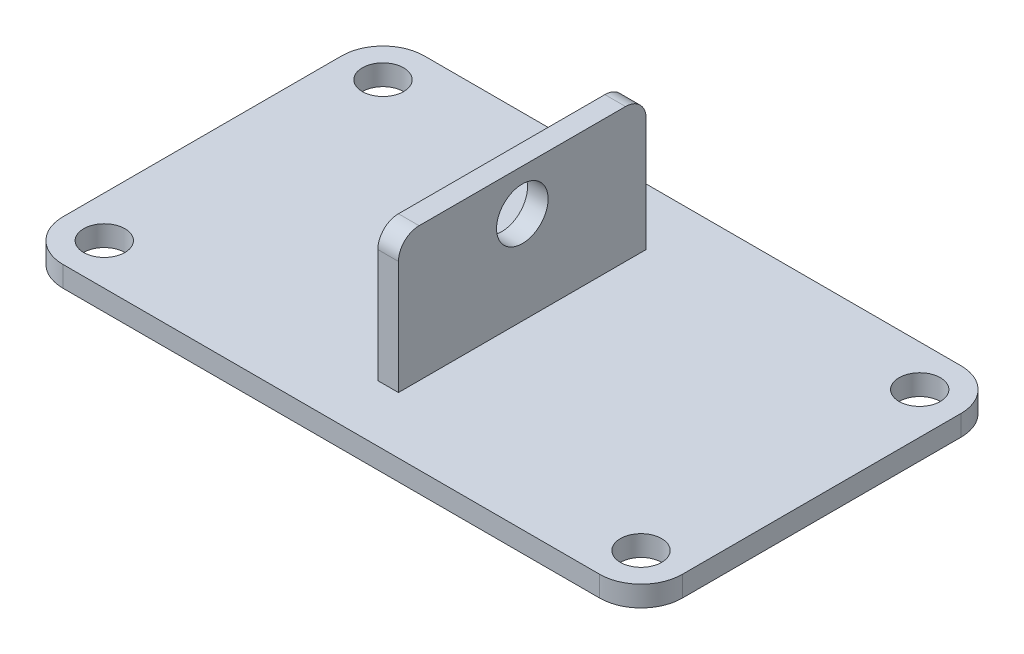
ISO-10303-21;
HEADER;
FILE_DESCRIPTION(('STEP AP214'),'2;1');
FILE_NAME('part.step','',(''),(''),'','','');
FILE_SCHEMA(('AUTOMOTIVE_DESIGN { 1 0 10303 214 1 1 1 1 }'));
ENDSEC;
DATA;
#1=APPLICATION_CONTEXT('core data for automotive mechanical design processes');
#2=APPLICATION_PROTOCOL_DEFINITION('international standard','automotive_design',2000,#1);
#3=PRODUCT_CONTEXT('',#1,'mechanical');
#4=PRODUCT('Part','Part','',(#3));
#5=PRODUCT_RELATED_PRODUCT_CATEGORY('part','',(#4));
#6=PRODUCT_DEFINITION_FORMATION('','',#4);
#7=PRODUCT_DEFINITION_CONTEXT('part definition',#1,'design');
#8=PRODUCT_DEFINITION('design','',#6,#7);
#9=PRODUCT_DEFINITION_SHAPE('','',#8);
#10=(LENGTH_UNIT() NAMED_UNIT(*) SI_UNIT(.MILLI.,.METRE.));
#11=(NAMED_UNIT(*) PLANE_ANGLE_UNIT() SI_UNIT($,.RADIAN.));
#12=(NAMED_UNIT(*) SI_UNIT($,.STERADIAN.) SOLID_ANGLE_UNIT());
#13=UNCERTAINTY_MEASURE_WITH_UNIT(LENGTH_MEASURE(1.E-05),#10,'distance_accuracy_value','');
#14=(GEOMETRIC_REPRESENTATION_CONTEXT(3) GLOBAL_UNCERTAINTY_ASSIGNED_CONTEXT((#13)) GLOBAL_UNIT_ASSIGNED_CONTEXT((#10,
#11,#12)) REPRESENTATION_CONTEXT('',''));
#15=CARTESIAN_POINT('',(0.,0.,0.));
#16=DIRECTION('',(0.,0.,1.));
#17=DIRECTION('',(1.,0.,0.));
#18=AXIS2_PLACEMENT_3D('',#15,#16,#17);
#19=CARTESIAN_POINT('',(130.,10.,-67.5));
#20=DIRECTION('',(0.,-1.,0.));
#21=DIRECTION('',(0.,0.,-1.));
#22=AXIS2_PLACEMENT_3D('',#19,#20,#21);
#23=PLANE('',#22);
#24=CARTESIAN_POINT('',(130.,10.,-67.5));
#25=DIRECTION('',(0.,1.,0.));
#26=DIRECTION('',(0.,0.,-1.));
#27=AXIS2_PLACEMENT_3D('',#24,#25,#26);
#28=CIRCLE('',#27,20.);
#29=CARTESIAN_POINT('',(150.,10.,-67.4999999999999));
#30=VERTEX_POINT('',#29);
#31=CARTESIAN_POINT('',(130.,10.,-87.5));
#32=VERTEX_POINT('',#31);
#33=EDGE_CURVE('E166',#30,#32,#28,.T.);
#34=ORIENTED_EDGE('',*,*,#33,.T.);
#35=DIRECTION('',(-1.,0.,0.));
#36=VECTOR('',#35,1.);
#37=CARTESIAN_POINT('',(-130.,10.,-87.5));
#38=LINE('',#37,#36);
#39=CARTESIAN_POINT('',(-130.,10.,-87.5));
#40=VERTEX_POINT('',#39);
#41=EDGE_CURVE('E175',#32,#40,#38,.T.);
#42=ORIENTED_EDGE('',*,*,#41,.T.);
#43=CARTESIAN_POINT('',(-130.,10.,-67.5));
#44=DIRECTION('',(0.,1.,0.));
#45=DIRECTION('',(0.,0.,1.));
#46=AXIS2_PLACEMENT_3D('',#43,#44,#45);
#47=CIRCLE('',#46,20.);
#48=CARTESIAN_POINT('',(-150.,10.,-67.4999999999999));
#49=VERTEX_POINT('',#48);
#50=EDGE_CURVE('E173',#40,#49,#47,.T.);
#51=ORIENTED_EDGE('',*,*,#50,.T.);
#52=DIRECTION('',(0.,0.,1.));
#53=VECTOR('',#52,1.);
#54=CARTESIAN_POINT('',(-150.,10.,67.4999999999999));
#55=LINE('',#54,#53);
#56=CARTESIAN_POINT('',(-150.,10.,67.4999999999999));
#57=VERTEX_POINT('',#56);
#58=EDGE_CURVE('E179',#49,#57,#55,.T.);
#59=ORIENTED_EDGE('',*,*,#58,.T.);
#60=CARTESIAN_POINT('',(-130.,10.,67.5));
#61=DIRECTION('',(0.,1.,0.));
#62=DIRECTION('',(0.,0.,-1.));
#63=AXIS2_PLACEMENT_3D('',#60,#61,#62);
#64=CIRCLE('',#63,20.);
#65=CARTESIAN_POINT('',(-130.,10.,87.5));
#66=VERTEX_POINT('',#65);
#67=EDGE_CURVE('E176',#57,#66,#64,.T.);
#68=ORIENTED_EDGE('',*,*,#67,.T.);
#69=DIRECTION('',(1.,0.,0.));
#70=VECTOR('',#69,1.);
#71=CARTESIAN_POINT('',(-130.,10.,87.5));
#72=LINE('',#71,#70);
#73=CARTESIAN_POINT('',(130.,10.,87.5));
#74=VERTEX_POINT('',#73);
#75=EDGE_CURVE('E182',#66,#74,#72,.T.);
#76=ORIENTED_EDGE('',*,*,#75,.T.);
#77=CARTESIAN_POINT('',(130.,10.,67.5));
#78=DIRECTION('',(0.,1.,0.));
#79=DIRECTION('',(0.,0.,1.));
#80=AXIS2_PLACEMENT_3D('',#77,#78,#79);
#81=CIRCLE('',#80,20.);
#82=CARTESIAN_POINT('',(150.,10.,67.4999999999999));
#83=VERTEX_POINT('',#82);
#84=EDGE_CURVE('E181',#74,#83,#81,.T.);
#85=ORIENTED_EDGE('',*,*,#84,.T.);
#86=DIRECTION('',(0.,0.,-1.));
#87=VECTOR('',#86,1.);
#88=CARTESIAN_POINT('',(150.,10.,67.4999999999999));
#89=LINE('',#88,#87);
#90=EDGE_CURVE('E183',#83,#30,#89,.T.);
#91=ORIENTED_EDGE('',*,*,#90,.T.);
#92=EDGE_LOOP('',(#34,#42,#51,#59,#68,#76,#85,#91));
#93=FACE_BOUND('',#92,.T.);
#94=DIRECTION('',(0.,0.,-1.));
#95=VECTOR('',#94,1.);
#96=CARTESIAN_POINT('',(5.,10.,60.));
#97=LINE('',#96,#95);
#98=CARTESIAN_POINT('',(5.,10.,60.));
#99=VERTEX_POINT('',#98);
#100=CARTESIAN_POINT('',(5.,10.,-60.));
#101=VERTEX_POINT('',#100);
#102=EDGE_CURVE('E157',#99,#101,#97,.T.);
#103=ORIENTED_EDGE('',*,*,#102,.F.);
#104=DIRECTION('',(1.,0.,0.));
#105=VECTOR('',#104,1.);
#106=CARTESIAN_POINT('',(-5.,10.,60.));
#107=LINE('',#106,#105);
#108=CARTESIAN_POINT('',(-5.,9.99999999999999,60.));
#109=VERTEX_POINT('',#108);
#110=EDGE_CURVE('E145',#109,#99,#107,.T.);
#111=ORIENTED_EDGE('',*,*,#110,.F.);
#112=DIRECTION('',(0.,0.,1.));
#113=VECTOR('',#112,1.);
#114=CARTESIAN_POINT('',(-5.,10.,60.));
#115=LINE('',#114,#113);
#116=CARTESIAN_POINT('',(-5.,10.,-60.));
#117=VERTEX_POINT('',#116);
#118=EDGE_CURVE('E156',#117,#109,#115,.T.);
#119=ORIENTED_EDGE('',*,*,#118,.F.);
#120=DIRECTION('',(-1.,0.,0.));
#121=VECTOR('',#120,1.);
#122=CARTESIAN_POINT('',(-5.,10.,-60.));
#123=LINE('',#122,#121);
#124=EDGE_CURVE('E163',#101,#117,#123,.T.);
#125=ORIENTED_EDGE('',*,*,#124,.F.);
#126=EDGE_LOOP('',(#103,#111,#119,#125));
#127=FACE_BOUND('',#126,.T.);
#128=CARTESIAN_POINT('',(130.,10.,-67.5));
#129=DIRECTION('',(0.,1.,0.));
#130=DIRECTION('',(0.,0.,1.));
#131=AXIS2_PLACEMENT_3D('',#128,#129,#130);
#132=CIRCLE('',#131,10.);
#133=CARTESIAN_POINT('',(130.,10.,-57.5));
#134=VERTEX_POINT('',#133);
#135=EDGE_CURVE('E284',#134,#134,#132,.T.);
#136=ORIENTED_EDGE('',*,*,#135,.F.);
#137=EDGE_LOOP('',(#136));
#138=FACE_BOUND('',#137,.T.);
#139=CARTESIAN_POINT('',(-130.,10.,-67.5));
#140=DIRECTION('',(0.,1.,0.));
#141=DIRECTION('',(0.,0.,-1.));
#142=AXIS2_PLACEMENT_3D('',#139,#140,#141);
#143=CIRCLE('',#142,10.);
#144=CARTESIAN_POINT('',(-130.,10.,-77.5));
#145=VERTEX_POINT('',#144);
#146=EDGE_CURVE('E280',#145,#145,#143,.T.);
#147=ORIENTED_EDGE('',*,*,#146,.F.);
#148=EDGE_LOOP('',(#147));
#149=FACE_BOUND('',#148,.T.);
#150=CARTESIAN_POINT('',(130.,10.,67.5));
#151=DIRECTION('',(0.,1.,0.));
#152=DIRECTION('',(0.,0.,-1.));
#153=AXIS2_PLACEMENT_3D('',#150,#151,#152);
#154=CIRCLE('',#153,10.);
#155=CARTESIAN_POINT('',(130.,10.,57.5));
#156=VERTEX_POINT('',#155);
#157=EDGE_CURVE('E271',#156,#156,#154,.T.);
#158=ORIENTED_EDGE('',*,*,#157,.F.);
#159=EDGE_LOOP('',(#158));
#160=FACE_BOUND('',#159,.T.);
#161=CARTESIAN_POINT('',(-130.,10.,67.5));
#162=DIRECTION('',(0.,1.,0.));
#163=DIRECTION('',(0.,0.,1.));
#164=AXIS2_PLACEMENT_3D('',#161,#162,#163);
#165=CIRCLE('',#164,10.);
#166=CARTESIAN_POINT('',(-130.,10.,77.5));
#167=VERTEX_POINT('',#166);
#168=EDGE_CURVE('E264',#167,#167,#165,.T.);
#169=ORIENTED_EDGE('',*,*,#168,.F.);
#170=EDGE_LOOP('',(#169));
#171=FACE_BOUND('',#170,.T.);
#172=ADVANCED_FACE('F41',(#93,#127,#138,#149,#160,#171),#23,.F.);
#173=CARTESIAN_POINT('',(130.,0.,-67.5));
#174=DIRECTION('',(0.,-1.,0.));
#175=DIRECTION('',(0.,0.,-1.));
#176=AXIS2_PLACEMENT_3D('',#173,#174,#175);
#177=PLANE('',#176);
#178=CARTESIAN_POINT('',(130.,0.,67.5));
#179=DIRECTION('',(0.,1.,0.));
#180=DIRECTION('',(0.,0.,-1.));
#181=AXIS2_PLACEMENT_3D('',#178,#179,#180);
#182=CIRCLE('',#181,10.);
#183=CARTESIAN_POINT('',(130.,0.,57.5));
#184=VERTEX_POINT('',#183);
#185=EDGE_CURVE('E268',#184,#184,#182,.T.);
#186=ORIENTED_EDGE('',*,*,#185,.T.);
#187=EDGE_LOOP('',(#186));
#188=FACE_BOUND('',#187,.T.);
#189=CARTESIAN_POINT('',(130.,0.,-67.5));
#190=DIRECTION('',(0.,1.,0.));
#191=DIRECTION('',(0.,0.,1.));
#192=AXIS2_PLACEMENT_3D('',#189,#190,#191);
#193=CIRCLE('',#192,10.);
#194=CARTESIAN_POINT('',(130.,0.,-57.5));
#195=VERTEX_POINT('',#194);
#196=EDGE_CURVE('E278',#195,#195,#193,.T.);
#197=ORIENTED_EDGE('',*,*,#196,.T.);
#198=EDGE_LOOP('',(#197));
#199=FACE_BOUND('',#198,.T.);
#200=CARTESIAN_POINT('',(130.,0.,-67.5));
#201=DIRECTION('',(0.,1.,0.));
#202=DIRECTION('',(0.,0.,-1.));
#203=AXIS2_PLACEMENT_3D('',#200,#201,#202);
#204=CIRCLE('',#203,20.);
#205=CARTESIAN_POINT('',(150.,0.,-67.4999999999999));
#206=VERTEX_POINT('',#205);
#207=CARTESIAN_POINT('',(130.,0.,-87.5));
#208=VERTEX_POINT('',#207);
#209=EDGE_CURVE('E159',#206,#208,#204,.T.);
#210=ORIENTED_EDGE('',*,*,#209,.F.);
#211=DIRECTION('',(0.,0.,-1.));
#212=VECTOR('',#211,1.);
#213=CARTESIAN_POINT('',(150.,0.,67.4999999999999));
#214=LINE('',#213,#212);
#215=CARTESIAN_POINT('',(150.,0.,67.4999999999999));
#216=VERTEX_POINT('',#215);
#217=EDGE_CURVE('E174',#216,#206,#214,.T.);
#218=ORIENTED_EDGE('',*,*,#217,.F.);
#219=CARTESIAN_POINT('',(130.,0.,67.5));
#220=DIRECTION('',(0.,1.,0.));
#221=DIRECTION('',(0.,0.,1.));
#222=AXIS2_PLACEMENT_3D('',#219,#220,#221);
#223=CIRCLE('',#222,20.);
#224=CARTESIAN_POINT('',(130.,0.,87.5));
#225=VERTEX_POINT('',#224);
#226=EDGE_CURVE('E199',#225,#216,#223,.T.);
#227=ORIENTED_EDGE('',*,*,#226,.F.);
#228=DIRECTION('',(1.,0.,0.));
#229=VECTOR('',#228,1.);
#230=CARTESIAN_POINT('',(-130.,0.,87.5));
#231=LINE('',#230,#229);
#232=CARTESIAN_POINT('',(-130.,0.,87.5));
#233=VERTEX_POINT('',#232);
#234=EDGE_CURVE('E196',#233,#225,#231,.T.);
#235=ORIENTED_EDGE('',*,*,#234,.F.);
#236=CARTESIAN_POINT('',(-130.,0.,67.5));
#237=DIRECTION('',(0.,1.,0.));
#238=DIRECTION('',(0.,0.,-1.));
#239=AXIS2_PLACEMENT_3D('',#236,#237,#238);
#240=CIRCLE('',#239,20.);
#241=CARTESIAN_POINT('',(-150.,0.,67.4999999999999));
#242=VERTEX_POINT('',#241);
#243=EDGE_CURVE('E198',#242,#233,#240,.T.);
#244=ORIENTED_EDGE('',*,*,#243,.F.);
#245=DIRECTION('',(0.,0.,1.));
#246=VECTOR('',#245,1.);
#247=CARTESIAN_POINT('',(-150.,0.,67.4999999999999));
#248=LINE('',#247,#246);
#249=CARTESIAN_POINT('',(-150.,0.,-67.4999999999999));
#250=VERTEX_POINT('',#249);
#251=EDGE_CURVE('E191',#250,#242,#248,.T.);
#252=ORIENTED_EDGE('',*,*,#251,.F.);
#253=CARTESIAN_POINT('',(-130.,0.,-67.5));
#254=DIRECTION('',(0.,1.,0.));
#255=DIRECTION('',(0.,0.,1.));
#256=AXIS2_PLACEMENT_3D('',#253,#254,#255);
#257=CIRCLE('',#256,20.);
#258=CARTESIAN_POINT('',(-130.,0.,-87.5));
#259=VERTEX_POINT('',#258);
#260=EDGE_CURVE('E194',#259,#250,#257,.T.);
#261=ORIENTED_EDGE('',*,*,#260,.F.);
#262=DIRECTION('',(-1.,0.,0.));
#263=VECTOR('',#262,1.);
#264=CARTESIAN_POINT('',(-130.,0.,-87.5));
#265=LINE('',#264,#263);
#266=EDGE_CURVE('E188',#208,#259,#265,.T.);
#267=ORIENTED_EDGE('',*,*,#266,.F.);
#268=EDGE_LOOP('',(#210,#218,#227,#235,#244,#252,#261,#267));
#269=FACE_BOUND('',#268,.T.);
#270=CARTESIAN_POINT('',(-130.,0.,-67.5));
#271=DIRECTION('',(0.,1.,0.));
#272=DIRECTION('',(0.,0.,-1.));
#273=AXIS2_PLACEMENT_3D('',#270,#271,#272);
#274=CIRCLE('',#273,10.);
#275=CARTESIAN_POINT('',(-130.,0.,-77.5));
#276=VERTEX_POINT('',#275);
#277=EDGE_CURVE('E273',#276,#276,#274,.T.);
#278=ORIENTED_EDGE('',*,*,#277,.T.);
#279=EDGE_LOOP('',(#278));
#280=FACE_BOUND('',#279,.T.);
#281=CARTESIAN_POINT('',(-130.,0.,67.5));
#282=DIRECTION('',(0.,1.,0.));
#283=DIRECTION('',(0.,0.,1.));
#284=AXIS2_PLACEMENT_3D('',#281,#282,#283);
#285=CIRCLE('',#284,10.);
#286=CARTESIAN_POINT('',(-130.,0.,77.5));
#287=VERTEX_POINT('',#286);
#288=EDGE_CURVE('E262',#287,#287,#285,.T.);
#289=ORIENTED_EDGE('',*,*,#288,.T.);
#290=EDGE_LOOP('',(#289));
#291=FACE_BOUND('',#290,.T.);
#292=ADVANCED_FACE('F299',(#188,#199,#269,#280,#291),#177,.T.);
#293=CARTESIAN_POINT('',(130.,10.,-67.5));
#294=DIRECTION('',(0.,-1.,0.));
#295=DIRECTION('',(0.,0.,-1.));
#296=AXIS2_PLACEMENT_3D('',#293,#294,#295);
#297=CYLINDRICAL_SURFACE('',#296,20.);
#298=ORIENTED_EDGE('',*,*,#209,.T.);
#299=DIRECTION('',(0.,-1.,0.));
#300=VECTOR('',#299,1.);
#301=CARTESIAN_POINT('',(130.,10.,-87.5));
#302=LINE('',#301,#300);
#303=EDGE_CURVE('E224',#32,#208,#302,.T.);
#304=ORIENTED_EDGE('',*,*,#303,.F.);
#305=ORIENTED_EDGE('',*,*,#33,.F.);
#306=DIRECTION('',(0.,-1.,0.));
#307=VECTOR('',#306,1.);
#308=CARTESIAN_POINT('',(150.,10.,-67.4999999999999));
#309=LINE('',#308,#307);
#310=EDGE_CURVE('E190',#30,#206,#309,.T.);
#311=ORIENTED_EDGE('',*,*,#310,.T.);
#312=EDGE_LOOP('',(#298,#304,#305,#311));
#313=FACE_BOUND('',#312,.T.);
#314=ADVANCED_FACE('F303',(#313),#297,.T.);
#315=CARTESIAN_POINT('',(-130.,10.,-87.5));
#316=DIRECTION('',(0.,0.,1.));
#317=DIRECTION('',(1.,0.,0.));
#318=AXIS2_PLACEMENT_3D('',#315,#316,#317);
#319=PLANE('',#318);
#320=ORIENTED_EDGE('',*,*,#266,.T.);
#321=DIRECTION('',(0.,-1.,0.));
#322=VECTOR('',#321,1.);
#323=CARTESIAN_POINT('',(-130.,10.,-87.5));
#324=LINE('',#323,#322);
#325=EDGE_CURVE('E219',#40,#259,#324,.T.);
#326=ORIENTED_EDGE('',*,*,#325,.F.);
#327=ORIENTED_EDGE('',*,*,#41,.F.);
#328=ORIENTED_EDGE('',*,*,#303,.T.);
#329=EDGE_LOOP('',(#320,#326,#327,#328));
#330=FACE_BOUND('',#329,.T.);
#331=ADVANCED_FACE('F333',(#330),#319,.F.);
#332=CARTESIAN_POINT('',(-130.,10.,-67.5));
#333=DIRECTION('',(0.,-1.,0.));
#334=DIRECTION('',(0.,0.,-1.));
#335=AXIS2_PLACEMENT_3D('',#332,#333,#334);
#336=CYLINDRICAL_SURFACE('',#335,20.);
#337=ORIENTED_EDGE('',*,*,#260,.T.);
#338=DIRECTION('',(0.,-1.,0.));
#339=VECTOR('',#338,1.);
#340=CARTESIAN_POINT('',(-150.,10.,-67.4999999999999));
#341=LINE('',#340,#339);
#342=EDGE_CURVE('E220',#49,#250,#341,.T.);
#343=ORIENTED_EDGE('',*,*,#342,.F.);
#344=ORIENTED_EDGE('',*,*,#50,.F.);
#345=ORIENTED_EDGE('',*,*,#325,.T.);
#346=EDGE_LOOP('',(#337,#343,#344,#345));
#347=FACE_BOUND('',#346,.T.);
#348=ADVANCED_FACE('F332',(#347),#336,.T.);
#349=CARTESIAN_POINT('',(-150.,10.,67.4999999999999));
#350=DIRECTION('',(1.,0.,0.));
#351=DIRECTION('',(0.,0.,-1.));
#352=AXIS2_PLACEMENT_3D('',#349,#350,#351);
#353=PLANE('',#352);
#354=ORIENTED_EDGE('',*,*,#251,.T.);
#355=DIRECTION('',(0.,-1.,0.));
#356=VECTOR('',#355,1.);
#357=CARTESIAN_POINT('',(-150.,10.,67.4999999999999));
#358=LINE('',#357,#356);
#359=EDGE_CURVE('E212',#57,#242,#358,.T.);
#360=ORIENTED_EDGE('',*,*,#359,.F.);
#361=ORIENTED_EDGE('',*,*,#58,.F.);
#362=ORIENTED_EDGE('',*,*,#342,.T.);
#363=EDGE_LOOP('',(#354,#360,#361,#362));
#364=FACE_BOUND('',#363,.T.);
#365=ADVANCED_FACE('F330',(#364),#353,.F.);
#366=CARTESIAN_POINT('',(-130.,10.,67.5));
#367=DIRECTION('',(0.,-1.,0.));
#368=DIRECTION('',(0.,0.,-1.));
#369=AXIS2_PLACEMENT_3D('',#366,#367,#368);
#370=CYLINDRICAL_SURFACE('',#369,20.);
#371=ORIENTED_EDGE('',*,*,#243,.T.);
#372=DIRECTION('',(0.,-1.,0.));
#373=VECTOR('',#372,1.);
#374=CARTESIAN_POINT('',(-130.,10.,87.5));
#375=LINE('',#374,#373);
#376=EDGE_CURVE('E211',#66,#233,#375,.T.);
#377=ORIENTED_EDGE('',*,*,#376,.F.);
#378=ORIENTED_EDGE('',*,*,#67,.F.);
#379=ORIENTED_EDGE('',*,*,#359,.T.);
#380=EDGE_LOOP('',(#371,#377,#378,#379));
#381=FACE_BOUND('',#380,.T.);
#382=ADVANCED_FACE('F323',(#381),#370,.T.);
#383=CARTESIAN_POINT('',(-130.,10.,87.5));
#384=DIRECTION('',(0.,0.,-1.));
#385=DIRECTION('',(-1.,0.,0.));
#386=AXIS2_PLACEMENT_3D('',#383,#384,#385);
#387=PLANE('',#386);
#388=ORIENTED_EDGE('',*,*,#234,.T.);
#389=DIRECTION('',(0.,-1.,0.));
#390=VECTOR('',#389,1.);
#391=CARTESIAN_POINT('',(130.,10.,87.5));
#392=LINE('',#391,#390);
#393=EDGE_CURVE('E208',#74,#225,#392,.T.);
#394=ORIENTED_EDGE('',*,*,#393,.F.);
#395=ORIENTED_EDGE('',*,*,#75,.F.);
#396=ORIENTED_EDGE('',*,*,#376,.T.);
#397=EDGE_LOOP('',(#388,#394,#395,#396));
#398=FACE_BOUND('',#397,.T.);
#399=ADVANCED_FACE('F317',(#398),#387,.F.);
#400=CARTESIAN_POINT('',(130.,10.,67.5));
#401=DIRECTION('',(0.,-1.,0.));
#402=DIRECTION('',(0.,0.,-1.));
#403=AXIS2_PLACEMENT_3D('',#400,#401,#402);
#404=CYLINDRICAL_SURFACE('',#403,20.);
#405=ORIENTED_EDGE('',*,*,#226,.T.);
#406=DIRECTION('',(0.,-1.,0.));
#407=VECTOR('',#406,1.);
#408=CARTESIAN_POINT('',(150.,10.,67.4999999999999));
#409=LINE('',#408,#407);
#410=EDGE_CURVE('E202',#83,#216,#409,.T.);
#411=ORIENTED_EDGE('',*,*,#410,.F.);
#412=ORIENTED_EDGE('',*,*,#84,.F.);
#413=ORIENTED_EDGE('',*,*,#393,.T.);
#414=EDGE_LOOP('',(#405,#411,#412,#413));
#415=FACE_BOUND('',#414,.T.);
#416=ADVANCED_FACE('F312',(#415),#404,.T.);
#417=CARTESIAN_POINT('',(150.,10.,67.4999999999999));
#418=DIRECTION('',(-1.,0.,0.));
#419=DIRECTION('',(0.,0.,1.));
#420=AXIS2_PLACEMENT_3D('',#417,#418,#419);
#421=PLANE('',#420);
#422=ORIENTED_EDGE('',*,*,#217,.T.);
#423=ORIENTED_EDGE('',*,*,#310,.F.);
#424=ORIENTED_EDGE('',*,*,#90,.F.);
#425=ORIENTED_EDGE('',*,*,#410,.T.);
#426=EDGE_LOOP('',(#422,#423,#424,#425));
#427=FACE_BOUND('',#426,.T.);
#428=ADVANCED_FACE('F315',(#427),#421,.F.);
#429=CARTESIAN_POINT('',(130.,10.,-67.5));
#430=DIRECTION('',(0.,-1.,0.));
#431=DIRECTION('',(0.,0.,-1.));
#432=AXIS2_PLACEMENT_3D('',#429,#430,#431);
#433=CYLINDRICAL_SURFACE('',#432,10.);
#434=ORIENTED_EDGE('',*,*,#135,.T.);
#435=EDGE_LOOP('',(#434));
#436=FACE_BOUND('',#435,.T.);
#437=ORIENTED_EDGE('',*,*,#196,.F.);
#438=EDGE_LOOP('',(#437));
#439=FACE_BOUND('',#438,.T.);
#440=ADVANCED_FACE('F310',(#436,#439),#433,.F.);
#441=CARTESIAN_POINT('',(-130.,10.,-67.5));
#442=DIRECTION('',(0.,-1.,0.));
#443=DIRECTION('',(0.,0.,-1.));
#444=AXIS2_PLACEMENT_3D('',#441,#442,#443);
#445=CYLINDRICAL_SURFACE('',#444,10.);
#446=ORIENTED_EDGE('',*,*,#146,.T.);
#447=EDGE_LOOP('',(#446));
#448=FACE_BOUND('',#447,.T.);
#449=ORIENTED_EDGE('',*,*,#277,.F.);
#450=EDGE_LOOP('',(#449));
#451=FACE_BOUND('',#450,.T.);
#452=ADVANCED_FACE('F381',(#448,#451),#445,.F.);
#453=CARTESIAN_POINT('',(130.,10.,67.5));
#454=DIRECTION('',(0.,-1.,0.));
#455=DIRECTION('',(0.,0.,-1.));
#456=AXIS2_PLACEMENT_3D('',#453,#454,#455);
#457=CYLINDRICAL_SURFACE('',#456,10.);
#458=ORIENTED_EDGE('',*,*,#157,.T.);
#459=EDGE_LOOP('',(#458));
#460=FACE_BOUND('',#459,.T.);
#461=ORIENTED_EDGE('',*,*,#185,.F.);
#462=EDGE_LOOP('',(#461));
#463=FACE_BOUND('',#462,.T.);
#464=ADVANCED_FACE('F373',(#460,#463),#457,.F.);
#465=CARTESIAN_POINT('',(-130.,10.,67.5));
#466=DIRECTION('',(0.,-1.,0.));
#467=DIRECTION('',(0.,0.,-1.));
#468=AXIS2_PLACEMENT_3D('',#465,#466,#467);
#469=CYLINDRICAL_SURFACE('',#468,10.);
#470=ORIENTED_EDGE('',*,*,#168,.T.);
#471=EDGE_LOOP('',(#470));
#472=FACE_BOUND('',#471,.T.);
#473=ORIENTED_EDGE('',*,*,#288,.F.);
#474=EDGE_LOOP('',(#473));
#475=FACE_BOUND('',#474,.T.);
#476=ADVANCED_FACE('F375',(#472,#475),#469,.F.);
#477=CARTESIAN_POINT('',(0.,75.,0.));
#478=DIRECTION('',(0.,1.,0.));
#479=DIRECTION('',(0.,0.,1.));
#480=AXIS2_PLACEMENT_3D('',#477,#478,#479);
#481=PLANE('',#480);
#482=DIRECTION('',(0.,0.,-1.));
#483=VECTOR('',#482,1.);
#484=CARTESIAN_POINT('',(5.,75.,0.));
#485=LINE('',#484,#483);
#486=CARTESIAN_POINT('',(5.,75.,50.));
#487=VERTEX_POINT('',#486);
#488=CARTESIAN_POINT('',(5.,75.,-50.));
#489=VERTEX_POINT('',#488);
#490=EDGE_CURVE('E248',#487,#489,#485,.T.);
#491=ORIENTED_EDGE('',*,*,#490,.T.);
#492=DIRECTION('',(1.,0.,0.));
#493=VECTOR('',#492,1.);
#494=CARTESIAN_POINT('',(0.,75.,-50.));
#495=LINE('',#494,#493);
#496=CARTESIAN_POINT('',(-5.,75.,-50.));
#497=VERTEX_POINT('',#496);
#498=EDGE_CURVE('E65',#489,#497,#495,.F.);
#499=ORIENTED_EDGE('',*,*,#498,.T.);
#500=DIRECTION('',(0.,0.,-1.));
#501=VECTOR('',#500,1.);
#502=CARTESIAN_POINT('',(-5.,75.,0.));
#503=LINE('',#502,#501);
#504=CARTESIAN_POINT('',(-5.,75.,50.));
#505=VERTEX_POINT('',#504);
#506=EDGE_CURVE('E149',#505,#497,#503,.T.);
#507=ORIENTED_EDGE('',*,*,#506,.F.);
#508=DIRECTION('',(1.,0.,0.));
#509=VECTOR('',#508,1.);
#510=CARTESIAN_POINT('',(5.,75.,50.));
#511=LINE('',#510,#509);
#512=EDGE_CURVE('E235',#505,#487,#511,.T.);
#513=ORIENTED_EDGE('',*,*,#512,.T.);
#514=EDGE_LOOP('',(#491,#499,#507,#513));
#515=FACE_BOUND('',#514,.T.);
#516=ADVANCED_FACE('F253',(#515),#481,.T.);
#517=CARTESIAN_POINT('',(-5.,75.,0.));
#518=DIRECTION('',(-1.,0.,0.));
#519=DIRECTION('',(0.,0.,1.));
#520=AXIS2_PLACEMENT_3D('',#517,#518,#519);
#521=PLANE('',#520);
#522=CARTESIAN_POINT('',(-5.,55.,0.));
#523=DIRECTION('',(-1.,0.,0.));
#524=DIRECTION('',(0.,0.,1.));
#525=AXIS2_PLACEMENT_3D('',#522,#523,#524);
#526=CIRCLE('',#525,12.5);
#527=CARTESIAN_POINT('',(-5.,55.,12.5));
#528=VERTEX_POINT('',#527);
#529=EDGE_CURVE('E251',#528,#528,#526,.T.);
#530=ORIENTED_EDGE('',*,*,#529,.F.);
#531=EDGE_LOOP('',(#530));
#532=FACE_BOUND('',#531,.T.);
#533=ORIENTED_EDGE('',*,*,#506,.T.);
#534=CARTESIAN_POINT('',(-5.,65.,-50.));
#535=DIRECTION('',(-1.,0.,0.));
#536=DIRECTION('',(0.,0.,1.));
#537=AXIS2_PLACEMENT_3D('',#534,#535,#536);
#538=CIRCLE('',#537,10.);
#539=CARTESIAN_POINT('',(-5.,65.,-60.));
#540=VERTEX_POINT('',#539);
#541=EDGE_CURVE('E47',#497,#540,#538,.T.);
#542=ORIENTED_EDGE('',*,*,#541,.T.);
#543=DIRECTION('',(0.,-1.,0.));
#544=VECTOR('',#543,1.);
#545=CARTESIAN_POINT('',(-5.,75.,-60.));
#546=LINE('',#545,#544);
#547=EDGE_CURVE('E146',#540,#117,#546,.T.);
#548=ORIENTED_EDGE('',*,*,#547,.T.);
#549=ORIENTED_EDGE('',*,*,#118,.T.);
#550=DIRECTION('',(0.,-1.,0.));
#551=VECTOR('',#550,1.);
#552=CARTESIAN_POINT('',(-5.,75.,60.));
#553=LINE('',#552,#551);
#554=CARTESIAN_POINT('',(-5.,65.,60.));
#555=VERTEX_POINT('',#554);
#556=EDGE_CURVE('E143',#555,#109,#553,.T.);
#557=ORIENTED_EDGE('',*,*,#556,.F.);
#558=CARTESIAN_POINT('',(-5.,65.,50.));
#559=DIRECTION('',(-1.,0.,0.));
#560=DIRECTION('',(0.,0.,1.));
#561=AXIS2_PLACEMENT_3D('',#558,#559,#560);
#562=CIRCLE('',#561,10.);
#563=EDGE_CURVE('E240',#555,#505,#562,.T.);
#564=ORIENTED_EDGE('',*,*,#563,.T.);
#565=EDGE_LOOP('',(#533,#542,#548,#549,#557,#564));
#566=FACE_BOUND('',#565,.T.);
#567=ADVANCED_FACE('F165',(#532,#566),#521,.T.);
#568=CARTESIAN_POINT('',(0.,75.,-60.));
#569=DIRECTION('',(0.,0.,-1.));
#570=DIRECTION('',(-1.,0.,0.));
#571=AXIS2_PLACEMENT_3D('',#568,#569,#570);
#572=PLANE('',#571);
#573=ORIENTED_EDGE('',*,*,#547,.F.);
#574=DIRECTION('',(1.,0.,0.));
#575=VECTOR('',#574,1.);
#576=CARTESIAN_POINT('',(0.,65.,-60.));
#577=LINE('',#576,#575);
#578=CARTESIAN_POINT('',(5.,65.,-60.));
#579=VERTEX_POINT('',#578);
#580=EDGE_CURVE('E227',#540,#579,#577,.T.);
#581=ORIENTED_EDGE('',*,*,#580,.T.);
#582=DIRECTION('',(0.,-1.,0.));
#583=VECTOR('',#582,1.);
#584=CARTESIAN_POINT('',(5.,75.,-60.));
#585=LINE('',#584,#583);
#586=EDGE_CURVE('E241',#579,#101,#585,.T.);
#587=ORIENTED_EDGE('',*,*,#586,.T.);
#588=ORIENTED_EDGE('',*,*,#124,.T.);
#589=EDGE_LOOP('',(#573,#581,#587,#588));
#590=FACE_BOUND('',#589,.T.);
#591=ADVANCED_FACE('F245',(#590),#572,.T.);
#592=CARTESIAN_POINT('',(5.,75.,0.));
#593=DIRECTION('',(-1.,0.,0.));
#594=DIRECTION('',(0.,0.,1.));
#595=AXIS2_PLACEMENT_3D('',#592,#593,#594);
#596=PLANE('',#595);
#597=CARTESIAN_POINT('',(5.,55.,0.));
#598=DIRECTION('',(1.,0.,0.));
#599=DIRECTION('',(0.,0.,-1.));
#600=AXIS2_PLACEMENT_3D('',#597,#598,#599);
#601=CIRCLE('',#600,12.5);
#602=CARTESIAN_POINT('',(5.,55.,-12.5));
#603=VERTEX_POINT('',#602);
#604=EDGE_CURVE('E260',#603,#603,#601,.T.);
#605=ORIENTED_EDGE('',*,*,#604,.F.);
#606=EDGE_LOOP('',(#605));
#607=FACE_BOUND('',#606,.T.);
#608=ORIENTED_EDGE('',*,*,#586,.F.);
#609=CARTESIAN_POINT('',(5.,65.,-50.));
#610=DIRECTION('',(-1.,0.,0.));
#611=DIRECTION('',(0.,0.,1.));
#612=AXIS2_PLACEMENT_3D('',#609,#610,#611);
#613=CIRCLE('',#612,10.);
#614=EDGE_CURVE('E232',#579,#489,#613,.F.);
#615=ORIENTED_EDGE('',*,*,#614,.T.);
#616=ORIENTED_EDGE('',*,*,#490,.F.);
#617=CARTESIAN_POINT('',(5.,65.,50.));
#618=DIRECTION('',(-1.,0.,0.));
#619=DIRECTION('',(0.,0.,1.));
#620=AXIS2_PLACEMENT_3D('',#617,#618,#619);
#621=CIRCLE('',#620,10.);
#622=CARTESIAN_POINT('',(5.,65.,60.));
#623=VERTEX_POINT('',#622);
#624=EDGE_CURVE('E226',#487,#623,#621,.F.);
#625=ORIENTED_EDGE('',*,*,#624,.T.);
#626=DIRECTION('',(0.,-1.,0.));
#627=VECTOR('',#626,1.);
#628=CARTESIAN_POINT('',(5.,75.,60.));
#629=LINE('',#628,#627);
#630=EDGE_CURVE('E265',#623,#99,#629,.T.);
#631=ORIENTED_EDGE('',*,*,#630,.T.);
#632=ORIENTED_EDGE('',*,*,#102,.T.);
#633=EDGE_LOOP('',(#608,#615,#616,#625,#631,#632));
#634=FACE_BOUND('',#633,.T.);
#635=ADVANCED_FACE('F246',(#607,#634),#596,.F.);
#636=CARTESIAN_POINT('',(0.,75.,60.));
#637=DIRECTION('',(0.,0.,-1.));
#638=DIRECTION('',(-1.,0.,0.));
#639=AXIS2_PLACEMENT_3D('',#636,#637,#638);
#640=PLANE('',#639);
#641=ORIENTED_EDGE('',*,*,#630,.F.);
#642=DIRECTION('',(1.,0.,0.));
#643=VECTOR('',#642,1.);
#644=CARTESIAN_POINT('',(-5.,65.,60.));
#645=LINE('',#644,#643);
#646=EDGE_CURVE('E11',#623,#555,#645,.F.);
#647=ORIENTED_EDGE('',*,*,#646,.T.);
#648=ORIENTED_EDGE('',*,*,#556,.T.);
#649=ORIENTED_EDGE('',*,*,#110,.T.);
#650=EDGE_LOOP('',(#641,#647,#648,#649));
#651=FACE_BOUND('',#650,.T.);
#652=ADVANCED_FACE('F141',(#651),#640,.F.);
#653=CARTESIAN_POINT('',(0.,65.,-50.));
#654=DIRECTION('',(1.,0.,0.));
#655=DIRECTION('',(0.,0.,-1.));
#656=AXIS2_PLACEMENT_3D('',#653,#654,#655);
#657=CYLINDRICAL_SURFACE('',#656,10.);
#658=ORIENTED_EDGE('',*,*,#541,.F.);
#659=ORIENTED_EDGE('',*,*,#498,.F.);
#660=ORIENTED_EDGE('',*,*,#614,.F.);
#661=ORIENTED_EDGE('',*,*,#580,.F.);
#662=EDGE_LOOP('',(#658,#659,#660,#661));
#663=FACE_BOUND('',#662,.T.);
#664=ADVANCED_FACE('F247',(#663),#657,.T.);
#665=CARTESIAN_POINT('',(0.,65.,50.));
#666=DIRECTION('',(-1.,0.,0.));
#667=DIRECTION('',(0.,0.,1.));
#668=AXIS2_PLACEMENT_3D('',#665,#666,#667);
#669=CYLINDRICAL_SURFACE('',#668,10.);
#670=ORIENTED_EDGE('',*,*,#563,.F.);
#671=ORIENTED_EDGE('',*,*,#646,.F.);
#672=ORIENTED_EDGE('',*,*,#624,.F.);
#673=ORIENTED_EDGE('',*,*,#512,.F.);
#674=EDGE_LOOP('',(#670,#671,#672,#673));
#675=FACE_BOUND('',#674,.T.);
#676=ADVANCED_FACE('F43',(#675),#669,.T.);
#677=CARTESIAN_POINT('',(-70.,55.,0.));
#678=DIRECTION('',(1.,0.,0.));
#679=DIRECTION('',(0.,0.,-1.));
#680=AXIS2_PLACEMENT_3D('',#677,#678,#679);
#681=CYLINDRICAL_SURFACE('',#680,12.5);
#682=ORIENTED_EDGE('',*,*,#529,.T.);
#683=EDGE_LOOP('',(#682));
#684=FACE_BOUND('',#683,.T.);
#685=ORIENTED_EDGE('',*,*,#604,.T.);
#686=EDGE_LOOP('',(#685));
#687=FACE_BOUND('',#686,.T.);
#688=ADVANCED_FACE('F286',(#684,#687),#681,.F.);
#689=CLOSED_SHELL('',(#172,#292,#314,#331,#348,#365,#382,#399,#416,#428,#440,#452,#464,#476,
#516,#567,#591,#635,#652,#664,#676,#688));
#690=MANIFOLD_SOLID_BREP('B2',#689);
#691=ADVANCED_BREP_SHAPE_REPRESENTATION('',(#18,#690),#14);
#692=SHAPE_DEFINITION_REPRESENTATION(#9,#691);
ENDSEC;
END-ISO-10303-21;
